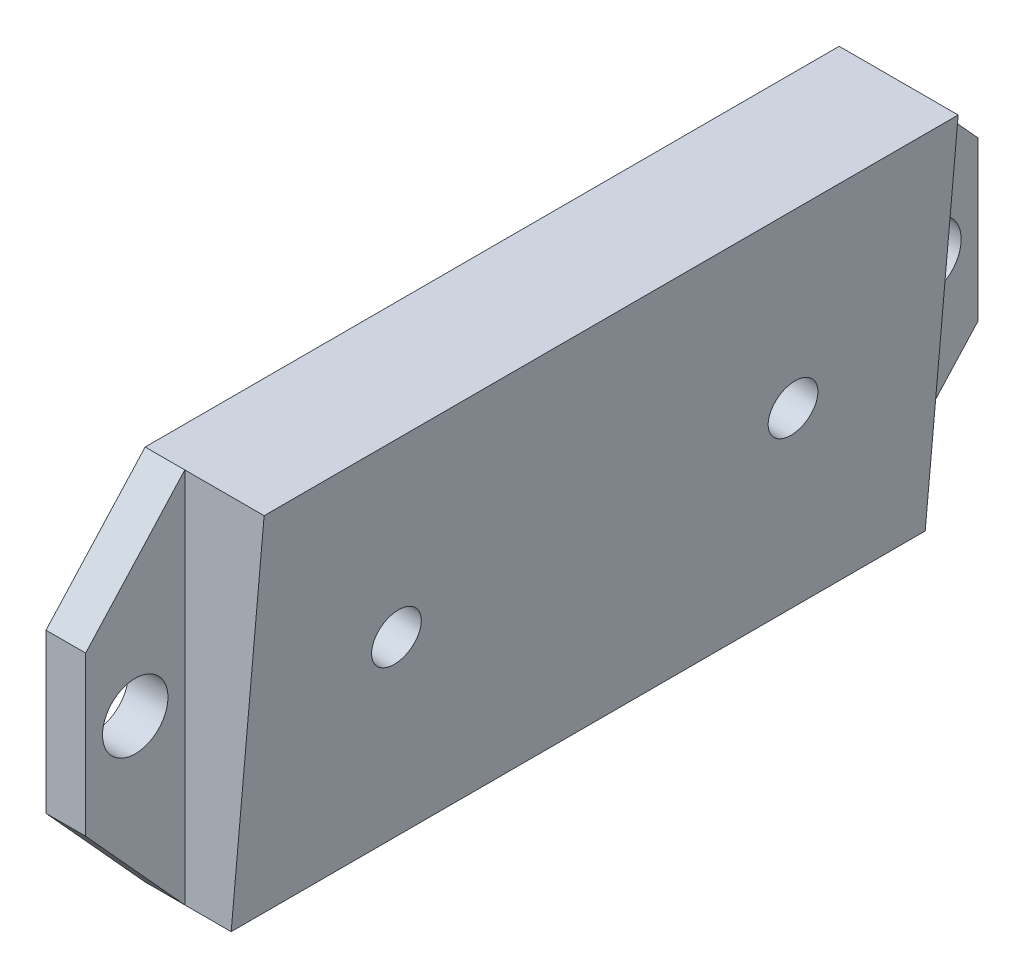
ISO-10303-21;
HEADER;
FILE_DESCRIPTION(('STEP AP214'),'2;1');
FILE_NAME('part.step','',(''),(''),'','','');
FILE_SCHEMA(('AUTOMOTIVE_DESIGN { 1 0 10303 214 1 1 1 1 }'));
ENDSEC;
DATA;
#1=APPLICATION_CONTEXT('core data for automotive mechanical design processes');
#2=APPLICATION_PROTOCOL_DEFINITION('international standard','automotive_design',2000,#1);
#3=PRODUCT_CONTEXT('',#1,'mechanical');
#4=PRODUCT('Part','Part','',(#3));
#5=PRODUCT_RELATED_PRODUCT_CATEGORY('part','',(#4));
#6=PRODUCT_DEFINITION_FORMATION('','',#4);
#7=PRODUCT_DEFINITION_CONTEXT('part definition',#1,'design');
#8=PRODUCT_DEFINITION('design','',#6,#7);
#9=PRODUCT_DEFINITION_SHAPE('','',#8);
#10=(LENGTH_UNIT() NAMED_UNIT(*) SI_UNIT(.MILLI.,.METRE.));
#11=(NAMED_UNIT(*) PLANE_ANGLE_UNIT() SI_UNIT($,.RADIAN.));
#12=(NAMED_UNIT(*) SI_UNIT($,.STERADIAN.) SOLID_ANGLE_UNIT());
#13=UNCERTAINTY_MEASURE_WITH_UNIT(LENGTH_MEASURE(1.E-05),#10,'distance_accuracy_value','');
#14=(GEOMETRIC_REPRESENTATION_CONTEXT(3) GLOBAL_UNCERTAINTY_ASSIGNED_CONTEXT((#13)) GLOBAL_UNIT_ASSIGNED_CONTEXT((#10,
#11,#12)) REPRESENTATION_CONTEXT('',''));
#15=CARTESIAN_POINT('',(0.,0.,0.));
#16=DIRECTION('',(0.,0.,1.));
#17=DIRECTION('',(1.,0.,0.));
#18=AXIS2_PLACEMENT_3D('',#15,#16,#17);
#19=CARTESIAN_POINT('',(8.67543078601516,-4.,80.));
#20=DIRECTION('',(-0.996194698091746,0.0871557427476512,0.));
#21=DIRECTION('',(-0.0871557427476512,-0.996194698091746,0.));
#22=AXIS2_PLACEMENT_3D('',#19,#20,#21);
#23=PLANE('',#22);
#24=CARTESIAN_POINT('',(10.3440408877946,15.0723007362568,15.));
#25=DIRECTION('',(-0.996194698091746,0.0871557427476512,0.));
#26=DIRECTION('',(0.0871557427476512,0.996194698091746,0.));
#27=AXIS2_PLACEMENT_3D('',#24,#25,#26);
#28=CIRCLE('',#27,2.49999999999999);
#29=CARTESIAN_POINT('',(10.5619302446638,17.5627874814862,15.));
#30=VERTEX_POINT('',#29);
#31=EDGE_CURVE('E155',#30,#30,#28,.T.);
#32=ORIENTED_EDGE('',*,*,#31,.T.);
#33=EDGE_LOOP('',(#32));
#34=FACE_BOUND('',#33,.T.);
#35=DIRECTION('',(0.,0.,-1.));
#36=VECTOR('',#35,1.);
#37=CARTESIAN_POINT('',(12.,34.,0.));
#38=LINE('',#37,#36);
#39=CARTESIAN_POINT('',(12.,34.,70.));
#40=VERTEX_POINT('',#39);
#41=CARTESIAN_POINT('',(12.,34.,0.));
#42=VERTEX_POINT('',#41);
#43=EDGE_CURVE('E225',#40,#42,#38,.T.);
#44=ORIENTED_EDGE('',*,*,#43,.F.);
#45=DIRECTION('',(-0.0871557427476512,-0.996194698091746,0.));
#46=VECTOR('',#45,1.);
#47=CARTESIAN_POINT('',(11.9392310120488,33.3054072893323,70.));
#48=LINE('',#47,#46);
#49=CARTESIAN_POINT('',(8.67543078601516,-4.,70.));
#50=VERTEX_POINT('',#49);
#51=EDGE_CURVE('E173',#40,#50,#48,.T.);
#52=ORIENTED_EDGE('',*,*,#51,.T.);
#53=DIRECTION('',(0.,0.,-1.));
#54=VECTOR('',#53,1.);
#55=CARTESIAN_POINT('',(8.67543078601516,-4.,80.));
#56=LINE('',#55,#54);
#57=CARTESIAN_POINT('',(8.67543078601516,-4.,0.));
#58=VERTEX_POINT('',#57);
#59=EDGE_CURVE('E170',#50,#58,#56,.T.);
#60=ORIENTED_EDGE('',*,*,#59,.T.);
#61=DIRECTION('',(-0.0871557427476512,-0.996194698091746,0.));
#62=VECTOR('',#61,1.);
#63=CARTESIAN_POINT('',(8.67543078601516,-4.,0.));
#64=LINE('',#63,#62);
#65=EDGE_CURVE('E167',#42,#58,#64,.T.);
#66=ORIENTED_EDGE('',*,*,#65,.F.);
#67=EDGE_LOOP('',(#44,#52,#60,#66));
#68=FACE_BOUND('',#67,.T.);
#69=CARTESIAN_POINT('',(10.3440408877946,15.0723007362568,55.));
#70=DIRECTION('',(-0.996194698091746,0.0871557427476512,0.));
#71=DIRECTION('',(0.0871557427476512,0.996194698091746,0.));
#72=AXIS2_PLACEMENT_3D('',#69,#70,#71);
#73=CIRCLE('',#72,2.49999999999999);
#74=CARTESIAN_POINT('',(10.5619302446638,17.5627874814862,55.));
#75=VERTEX_POINT('',#74);
#76=EDGE_CURVE('E154',#75,#75,#73,.T.);
#77=ORIENTED_EDGE('',*,*,#76,.T.);
#78=EDGE_LOOP('',(#77));
#79=FACE_BOUND('',#78,.T.);
#80=ADVANCED_FACE('F37',(#34,#68,#79),#23,.F.);
#81=CARTESIAN_POINT('',(12.,7.,-10.));
#82=DIRECTION('',(0.,0.672672793996312,0.739940073395944));
#83=DIRECTION('',(0.,0.739940073395944,-0.672672793996312));
#84=AXIS2_PLACEMENT_3D('',#81,#82,#83);
#85=PLANE('',#84);
#86=DIRECTION('',(0.,-0.739940073395944,0.672672793996312));
#87=VECTOR('',#86,1.);
#88=CARTESIAN_POINT('',(4.,7.,-10.));
#89=LINE('',#88,#87);
#90=CARTESIAN_POINT('',(4.,7.,-10.));
#91=VERTEX_POINT('',#90);
#92=CARTESIAN_POINT('',(4.,-4.,0.));
#93=VERTEX_POINT('',#92);
#94=EDGE_CURVE('E183',#91,#93,#89,.T.);
#95=ORIENTED_EDGE('',*,*,#94,.T.);
#96=DIRECTION('',(-1.,0.,0.));
#97=VECTOR('',#96,1.);
#98=CARTESIAN_POINT('',(12.,-4.,0.));
#99=LINE('',#98,#97);
#100=CARTESIAN_POINT('',(0.,-4.,0.));
#101=VERTEX_POINT('',#100);
#102=EDGE_CURVE('E45',#93,#101,#99,.T.);
#103=ORIENTED_EDGE('',*,*,#102,.T.);
#104=DIRECTION('',(0.,-0.739940073395944,0.672672793996312));
#105=VECTOR('',#104,1.);
#106=CARTESIAN_POINT('',(0.,7.,-10.));
#107=LINE('',#106,#105);
#108=CARTESIAN_POINT('',(0.,7.,-10.));
#109=VERTEX_POINT('',#108);
#110=EDGE_CURVE('E224',#109,#101,#107,.T.);
#111=ORIENTED_EDGE('',*,*,#110,.F.);
#112=DIRECTION('',(-1.,0.,0.));
#113=VECTOR('',#112,1.);
#114=CARTESIAN_POINT('',(12.,7.,-10.));
#115=LINE('',#114,#113);
#116=EDGE_CURVE('E228',#91,#109,#115,.T.);
#117=ORIENTED_EDGE('',*,*,#116,.F.);
#118=EDGE_LOOP('',(#95,#103,#111,#117));
#119=FACE_BOUND('',#118,.T.);
#120=ADVANCED_FACE('F39',(#119),#85,.F.);
#121=CARTESIAN_POINT('',(12.,7.,80.));
#122=DIRECTION('',(0.,0.672672793996311,-0.739940073395945));
#123=DIRECTION('',(0.,-0.739940073395945,-0.672672793996311));
#124=AXIS2_PLACEMENT_3D('',#121,#122,#123);
#125=PLANE('',#124);
#126=DIRECTION('',(0.,0.739940073395945,0.672672793996311));
#127=VECTOR('',#126,1.);
#128=CARTESIAN_POINT('',(4.,7.,80.));
#129=LINE('',#128,#127);
#130=CARTESIAN_POINT('',(4.,-4.,70.));
#131=VERTEX_POINT('',#130);
#132=CARTESIAN_POINT('',(4.,7.,80.));
#133=VERTEX_POINT('',#132);
#134=EDGE_CURVE('E176',#131,#133,#129,.T.);
#135=ORIENTED_EDGE('',*,*,#134,.T.);
#136=DIRECTION('',(-1.,0.,0.));
#137=VECTOR('',#136,1.);
#138=CARTESIAN_POINT('',(12.,7.,80.));
#139=LINE('',#138,#137);
#140=CARTESIAN_POINT('',(0.,7.,80.));
#141=VERTEX_POINT('',#140);
#142=EDGE_CURVE('E265',#133,#141,#139,.T.);
#143=ORIENTED_EDGE('',*,*,#142,.T.);
#144=DIRECTION('',(0.,0.739940073395945,0.672672793996311));
#145=VECTOR('',#144,1.);
#146=CARTESIAN_POINT('',(0.,7.,80.));
#147=LINE('',#146,#145);
#148=CARTESIAN_POINT('',(0.,-4.00000000000002,70.));
#149=VERTEX_POINT('',#148);
#150=EDGE_CURVE('E234',#149,#141,#147,.T.);
#151=ORIENTED_EDGE('',*,*,#150,.F.);
#152=DIRECTION('',(-1.,0.,0.));
#153=VECTOR('',#152,1.);
#154=CARTESIAN_POINT('',(12.,-4.00000000000002,70.));
#155=LINE('',#154,#153);
#156=EDGE_CURVE('E267',#131,#149,#155,.T.);
#157=ORIENTED_EDGE('',*,*,#156,.F.);
#158=EDGE_LOOP('',(#135,#143,#151,#157));
#159=FACE_BOUND('',#158,.T.);
#160=ADVANCED_FACE('F280',(#159),#125,.F.);
#161=CARTESIAN_POINT('',(12.,7.,80.));
#162=DIRECTION('',(0.,0.,-1.));
#163=DIRECTION('',(1.,0.,0.));
#164=AXIS2_PLACEMENT_3D('',#161,#162,#163);
#165=PLANE('',#164);
#166=DIRECTION('',(0.,1.,0.));
#167=VECTOR('',#166,1.);
#168=CARTESIAN_POINT('',(4.,23.,80.));
#169=LINE('',#168,#167);
#170=CARTESIAN_POINT('',(4.,23.,80.));
#171=VERTEX_POINT('',#170);
#172=EDGE_CURVE('E191',#133,#171,#169,.T.);
#173=ORIENTED_EDGE('',*,*,#172,.T.);
#174=DIRECTION('',(-1.,0.,0.));
#175=VECTOR('',#174,1.);
#176=CARTESIAN_POINT('',(12.,23.,80.));
#177=LINE('',#176,#175);
#178=CARTESIAN_POINT('',(0.,23.,80.));
#179=VERTEX_POINT('',#178);
#180=EDGE_CURVE('E262',#171,#179,#177,.T.);
#181=ORIENTED_EDGE('',*,*,#180,.T.);
#182=DIRECTION('',(0.,1.,0.));
#183=VECTOR('',#182,1.);
#184=CARTESIAN_POINT('',(0.,7.,80.));
#185=LINE('',#184,#183);
#186=EDGE_CURVE('E237',#141,#179,#185,.T.);
#187=ORIENTED_EDGE('',*,*,#186,.F.);
#188=ORIENTED_EDGE('',*,*,#142,.F.);
#189=EDGE_LOOP('',(#173,#181,#187,#188));
#190=FACE_BOUND('',#189,.T.);
#191=ADVANCED_FACE('F302',(#190),#165,.F.);
#192=CARTESIAN_POINT('',(12.,23.,80.));
#193=DIRECTION('',(0.,-0.672672793996311,-0.739940073395945));
#194=DIRECTION('',(0.,-0.739940073395945,0.672672793996311));
#195=AXIS2_PLACEMENT_3D('',#192,#193,#194);
#196=PLANE('',#195);
#197=DIRECTION('',(0.,0.739940073395945,-0.672672793996311));
#198=VECTOR('',#197,1.);
#199=CARTESIAN_POINT('',(4.,34.,70.));
#200=LINE('',#199,#198);
#201=CARTESIAN_POINT('',(4.,34.,70.));
#202=VERTEX_POINT('',#201);
#203=EDGE_CURVE('E194',#171,#202,#200,.T.);
#204=ORIENTED_EDGE('',*,*,#203,.T.);
#205=DIRECTION('',(-1.,0.,0.));
#206=VECTOR('',#205,1.);
#207=CARTESIAN_POINT('',(12.,34.,70.));
#208=LINE('',#207,#206);
#209=CARTESIAN_POINT('',(0.,34.,70.));
#210=VERTEX_POINT('',#209);
#211=EDGE_CURVE('E258',#202,#210,#208,.T.);
#212=ORIENTED_EDGE('',*,*,#211,.T.);
#213=DIRECTION('',(0.,0.739940073395945,-0.672672793996311));
#214=VECTOR('',#213,1.);
#215=CARTESIAN_POINT('',(0.,23.,80.));
#216=LINE('',#215,#214);
#217=EDGE_CURVE('E240',#179,#210,#216,.T.);
#218=ORIENTED_EDGE('',*,*,#217,.F.);
#219=ORIENTED_EDGE('',*,*,#180,.F.);
#220=EDGE_LOOP('',(#204,#212,#218,#219));
#221=FACE_BOUND('',#220,.T.);
#222=ADVANCED_FACE('F304',(#221),#196,.F.);
#223=CARTESIAN_POINT('',(12.,23.,-10.));
#224=DIRECTION('',(0.,-0.672672793996312,0.739940073395944));
#225=DIRECTION('',(0.,0.739940073395944,0.672672793996312));
#226=AXIS2_PLACEMENT_3D('',#223,#224,#225);
#227=PLANE('',#226);
#228=DIRECTION('',(0.,-0.739940073395944,-0.672672793996312));
#229=VECTOR('',#228,1.);
#230=CARTESIAN_POINT('',(4.,34.,0.));
#231=LINE('',#230,#229);
#232=CARTESIAN_POINT('',(4.,34.,0.));
#233=VERTEX_POINT('',#232);
#234=CARTESIAN_POINT('',(4.,23.,-10.));
#235=VERTEX_POINT('',#234);
#236=EDGE_CURVE('E177',#233,#235,#231,.T.);
#237=ORIENTED_EDGE('',*,*,#236,.T.);
#238=DIRECTION('',(-1.,0.,0.));
#239=VECTOR('',#238,1.);
#240=CARTESIAN_POINT('',(12.,23.,-10.));
#241=LINE('',#240,#239);
#242=CARTESIAN_POINT('',(0.,23.,-10.));
#243=VERTEX_POINT('',#242);
#244=EDGE_CURVE('E251',#235,#243,#241,.T.);
#245=ORIENTED_EDGE('',*,*,#244,.T.);
#246=DIRECTION('',(0.,-0.739940073395944,-0.672672793996312));
#247=VECTOR('',#246,1.);
#248=CARTESIAN_POINT('',(0.,23.,-10.));
#249=LINE('',#248,#247);
#250=CARTESIAN_POINT('',(0.,34.,0.));
#251=VERTEX_POINT('',#250);
#252=EDGE_CURVE('E245',#251,#243,#249,.T.);
#253=ORIENTED_EDGE('',*,*,#252,.F.);
#254=DIRECTION('',(-1.,0.,0.));
#255=VECTOR('',#254,1.);
#256=CARTESIAN_POINT('',(12.,34.,0.));
#257=LINE('',#256,#255);
#258=EDGE_CURVE('E254',#233,#251,#257,.T.);
#259=ORIENTED_EDGE('',*,*,#258,.F.);
#260=EDGE_LOOP('',(#237,#245,#253,#259));
#261=FACE_BOUND('',#260,.T.);
#262=ADVANCED_FACE('F313',(#261),#227,.F.);
#263=CARTESIAN_POINT('',(12.,7.,-10.));
#264=DIRECTION('',(0.,0.,1.));
#265=DIRECTION('',(-1.,0.,0.));
#266=AXIS2_PLACEMENT_3D('',#263,#264,#265);
#267=PLANE('',#266);
#268=DIRECTION('',(0.,-1.,0.));
#269=VECTOR('',#268,1.);
#270=CARTESIAN_POINT('',(4.,23.,-10.));
#271=LINE('',#270,#269);
#272=EDGE_CURVE('E180',#235,#91,#271,.T.);
#273=ORIENTED_EDGE('',*,*,#272,.T.);
#274=ORIENTED_EDGE('',*,*,#116,.T.);
#275=DIRECTION('',(0.,-1.,0.));
#276=VECTOR('',#275,1.);
#277=CARTESIAN_POINT('',(0.,7.,-10.));
#278=LINE('',#277,#276);
#279=EDGE_CURVE('E229',#243,#109,#278,.T.);
#280=ORIENTED_EDGE('',*,*,#279,.F.);
#281=ORIENTED_EDGE('',*,*,#244,.F.);
#282=EDGE_LOOP('',(#273,#274,#280,#281));
#283=FACE_BOUND('',#282,.T.);
#284=ADVANCED_FACE('F316',(#283),#267,.F.);
#285=CARTESIAN_POINT('',(12.,-4.,0.));
#286=DIRECTION('',(0.,1.,0.));
#287=DIRECTION('',(0.,0.,-1.));
#288=AXIS2_PLACEMENT_3D('',#285,#286,#287);
#289=PLANE('',#288);
#290=EDGE_CURVE('E268',#50,#131,#155,.T.);
#291=ORIENTED_EDGE('',*,*,#290,.T.);
#292=ORIENTED_EDGE('',*,*,#156,.T.);
#293=DIRECTION('',(0.,0.,1.));
#294=VECTOR('',#293,1.);
#295=CARTESIAN_POINT('',(0.,-4.,0.));
#296=LINE('',#295,#294);
#297=EDGE_CURVE('E232',#101,#149,#296,.T.);
#298=ORIENTED_EDGE('',*,*,#297,.F.);
#299=ORIENTED_EDGE('',*,*,#102,.F.);
#300=EDGE_CURVE('E11',#58,#93,#99,.T.);
#301=ORIENTED_EDGE('',*,*,#300,.F.);
#302=ORIENTED_EDGE('',*,*,#59,.F.);
#303=EDGE_LOOP('',(#291,#292,#298,#299,#301,#302));
#304=FACE_BOUND('',#303,.T.);
#305=ADVANCED_FACE('F276',(#304),#289,.F.);
#306=CARTESIAN_POINT('',(12.,34.,0.));
#307=DIRECTION('',(0.,-1.,0.));
#308=DIRECTION('',(0.,0.,1.));
#309=AXIS2_PLACEMENT_3D('',#306,#307,#308);
#310=PLANE('',#309);
#311=DIRECTION('',(0.,0.,-1.));
#312=VECTOR('',#311,1.);
#313=CARTESIAN_POINT('',(0.,34.,0.));
#314=LINE('',#313,#312);
#315=EDGE_CURVE('E243',#210,#251,#314,.T.);
#316=ORIENTED_EDGE('',*,*,#315,.F.);
#317=ORIENTED_EDGE('',*,*,#211,.F.);
#318=EDGE_CURVE('E259',#40,#202,#208,.T.);
#319=ORIENTED_EDGE('',*,*,#318,.F.);
#320=ORIENTED_EDGE('',*,*,#43,.T.);
#321=EDGE_CURVE('E255',#42,#233,#257,.T.);
#322=ORIENTED_EDGE('',*,*,#321,.T.);
#323=ORIENTED_EDGE('',*,*,#258,.T.);
#324=EDGE_LOOP('',(#316,#317,#319,#320,#322,#323));
#325=FACE_BOUND('',#324,.T.);
#326=ADVANCED_FACE('F310',(#325),#310,.F.);
#327=CARTESIAN_POINT('',(0.,0.,0.));
#328=DIRECTION('',(-1.,0.,0.));
#329=DIRECTION('',(0.,0.,-1.));
#330=AXIS2_PLACEMENT_3D('',#327,#328,#329);
#331=PLANE('',#330);
#332=CARTESIAN_POINT('',(0.,15.,-5.));
#333=DIRECTION('',(1.,0.,0.));
#334=DIRECTION('',(0.,0.,-1.));
#335=AXIS2_PLACEMENT_3D('',#332,#333,#334);
#336=CIRCLE('',#335,3.29999999999999);
#337=CARTESIAN_POINT('',(0.,15.,-8.29999999999999));
#338=VERTEX_POINT('',#337);
#339=EDGE_CURVE('E355',#338,#338,#336,.T.);
#340=ORIENTED_EDGE('',*,*,#339,.T.);
#341=EDGE_LOOP('',(#340));
#342=FACE_BOUND('',#341,.T.);
#343=CARTESIAN_POINT('',(0.,15.,75.));
#344=DIRECTION('',(1.,0.,0.));
#345=DIRECTION('',(0.,0.,-1.));
#346=AXIS2_PLACEMENT_3D('',#343,#344,#345);
#347=CIRCLE('',#346,3.29999999999999);
#348=CARTESIAN_POINT('',(0.,15.,71.7));
#349=VERTEX_POINT('',#348);
#350=EDGE_CURVE('E161',#349,#349,#347,.T.);
#351=ORIENTED_EDGE('',*,*,#350,.T.);
#352=EDGE_LOOP('',(#351));
#353=FACE_BOUND('',#352,.T.);
#354=CARTESIAN_POINT('',(0.,15.,55.));
#355=DIRECTION('',(1.,0.,0.));
#356=DIRECTION('',(0.,0.,-1.));
#357=AXIS2_PLACEMENT_3D('',#354,#355,#356);
#358=CIRCLE('',#357,5.);
#359=CARTESIAN_POINT('',(0.,20.,55.));
#360=VERTEX_POINT('',#359);
#361=CARTESIAN_POINT('',(0.,10.,55.));
#362=VERTEX_POINT('',#361);
#363=EDGE_CURVE('E188',#360,#362,#358,.T.);
#364=ORIENTED_EDGE('',*,*,#363,.T.);
#365=DIRECTION('',(0.,0.,-1.));
#366=VECTOR('',#365,1.);
#367=CARTESIAN_POINT('',(0.,10.,55.));
#368=LINE('',#367,#366);
#369=CARTESIAN_POINT('',(0.,10.,15.));
#370=VERTEX_POINT('',#369);
#371=EDGE_CURVE('E211',#362,#370,#368,.T.);
#372=ORIENTED_EDGE('',*,*,#371,.T.);
#373=CARTESIAN_POINT('',(0.,15.,15.));
#374=DIRECTION('',(1.,0.,0.));
#375=DIRECTION('',(0.,0.,-1.));
#376=AXIS2_PLACEMENT_3D('',#373,#374,#375);
#377=CIRCLE('',#376,5.);
#378=CARTESIAN_POINT('',(0.,20.,15.));
#379=VERTEX_POINT('',#378);
#380=EDGE_CURVE('E214',#370,#379,#377,.T.);
#381=ORIENTED_EDGE('',*,*,#380,.T.);
#382=DIRECTION('',(0.,0.,1.));
#383=VECTOR('',#382,1.);
#384=CARTESIAN_POINT('',(0.,20.,55.));
#385=LINE('',#384,#383);
#386=EDGE_CURVE('E202',#379,#360,#385,.T.);
#387=ORIENTED_EDGE('',*,*,#386,.T.);
#388=EDGE_LOOP('',(#364,#372,#381,#387));
#389=FACE_BOUND('',#388,.T.);
#390=ORIENTED_EDGE('',*,*,#110,.T.);
#391=ORIENTED_EDGE('',*,*,#297,.T.);
#392=ORIENTED_EDGE('',*,*,#150,.T.);
#393=ORIENTED_EDGE('',*,*,#186,.T.);
#394=ORIENTED_EDGE('',*,*,#217,.T.);
#395=ORIENTED_EDGE('',*,*,#315,.T.);
#396=ORIENTED_EDGE('',*,*,#252,.T.);
#397=ORIENTED_EDGE('',*,*,#279,.T.);
#398=EDGE_LOOP('',(#390,#391,#392,#393,#394,#395,#396,#397));
#399=FACE_BOUND('',#398,.T.);
#400=ADVANCED_FACE('F283',(#342,#353,#389,#399),#331,.T.);
#401=CARTESIAN_POINT('',(-10.,15.,55.));
#402=DIRECTION('',(1.,0.,0.));
#403=DIRECTION('',(0.,0.,1.));
#404=AXIS2_PLACEMENT_3D('',#401,#402,#403);
#405=CYLINDRICAL_SURFACE('',#404,5.);
#406=ORIENTED_EDGE('',*,*,#363,.F.);
#407=DIRECTION('',(1.,0.,0.));
#408=VECTOR('',#407,1.);
#409=CARTESIAN_POINT('',(-10.,20.,55.));
#410=LINE('',#409,#408);
#411=CARTESIAN_POINT('',(-10.,20.,55.));
#412=VERTEX_POINT('',#411);
#413=EDGE_CURVE('E52',#412,#360,#410,.T.);
#414=ORIENTED_EDGE('',*,*,#413,.F.);
#415=CARTESIAN_POINT('',(-10.,15.,55.));
#416=DIRECTION('',(1.,0.,0.));
#417=DIRECTION('',(0.,0.,-1.));
#418=AXIS2_PLACEMENT_3D('',#415,#416,#417);
#419=CIRCLE('',#418,5.);
#420=CARTESIAN_POINT('',(-10.,10.,55.));
#421=VERTEX_POINT('',#420);
#422=EDGE_CURVE('E198',#412,#421,#419,.T.);
#423=ORIENTED_EDGE('',*,*,#422,.T.);
#424=DIRECTION('',(1.,0.,0.));
#425=VECTOR('',#424,1.);
#426=CARTESIAN_POINT('',(-10.,10.,55.));
#427=LINE('',#426,#425);
#428=EDGE_CURVE('E222',#421,#362,#427,.T.);
#429=ORIENTED_EDGE('',*,*,#428,.T.);
#430=EDGE_LOOP('',(#406,#414,#423,#429));
#431=FACE_BOUND('',#430,.T.);
#432=ADVANCED_FACE('F390',(#431),#405,.T.);
#433=CARTESIAN_POINT('',(-10.,10.,55.));
#434=DIRECTION('',(0.,1.,0.));
#435=DIRECTION('',(0.,0.,-1.));
#436=AXIS2_PLACEMENT_3D('',#433,#434,#435);
#437=PLANE('',#436);
#438=ORIENTED_EDGE('',*,*,#371,.F.);
#439=ORIENTED_EDGE('',*,*,#428,.F.);
#440=DIRECTION('',(0.,0.,-1.));
#441=VECTOR('',#440,1.);
#442=CARTESIAN_POINT('',(-10.,10.,55.));
#443=LINE('',#442,#441);
#444=CARTESIAN_POINT('',(-10.,10.,15.));
#445=VERTEX_POINT('',#444);
#446=EDGE_CURVE('E201',#421,#445,#443,.T.);
#447=ORIENTED_EDGE('',*,*,#446,.T.);
#448=DIRECTION('',(1.,0.,0.));
#449=VECTOR('',#448,1.);
#450=CARTESIAN_POINT('',(-10.,10.,15.));
#451=LINE('',#450,#449);
#452=EDGE_CURVE('E220',#445,#370,#451,.T.);
#453=ORIENTED_EDGE('',*,*,#452,.T.);
#454=EDGE_LOOP('',(#438,#439,#447,#453));
#455=FACE_BOUND('',#454,.T.);
#456=ADVANCED_FACE('F387',(#455),#437,.F.);
#457=CARTESIAN_POINT('',(-10.,15.,15.));
#458=DIRECTION('',(1.,0.,0.));
#459=DIRECTION('',(0.,0.,1.));
#460=AXIS2_PLACEMENT_3D('',#457,#458,#459);
#461=CYLINDRICAL_SURFACE('',#460,5.);
#462=ORIENTED_EDGE('',*,*,#380,.F.);
#463=ORIENTED_EDGE('',*,*,#452,.F.);
#464=CARTESIAN_POINT('',(-10.,15.,15.));
#465=DIRECTION('',(1.,0.,0.));
#466=DIRECTION('',(0.,0.,-1.));
#467=AXIS2_PLACEMENT_3D('',#464,#465,#466);
#468=CIRCLE('',#467,5.);
#469=CARTESIAN_POINT('',(-10.,20.,15.));
#470=VERTEX_POINT('',#469);
#471=EDGE_CURVE('E205',#445,#470,#468,.T.);
#472=ORIENTED_EDGE('',*,*,#471,.T.);
#473=DIRECTION('',(1.,0.,0.));
#474=VECTOR('',#473,1.);
#475=CARTESIAN_POINT('',(-10.,20.,15.));
#476=LINE('',#475,#474);
#477=EDGE_CURVE('E60',#470,#379,#476,.T.);
#478=ORIENTED_EDGE('',*,*,#477,.T.);
#479=EDGE_LOOP('',(#462,#463,#472,#478));
#480=FACE_BOUND('',#479,.T.);
#481=ADVANCED_FACE('F384',(#480),#461,.T.);
#482=CARTESIAN_POINT('',(-10.,20.,55.));
#483=DIRECTION('',(0.,-1.,0.));
#484=DIRECTION('',(0.,0.,1.));
#485=AXIS2_PLACEMENT_3D('',#482,#483,#484);
#486=PLANE('',#485);
#487=ORIENTED_EDGE('',*,*,#386,.F.);
#488=ORIENTED_EDGE('',*,*,#477,.F.);
#489=DIRECTION('',(0.,0.,1.));
#490=VECTOR('',#489,1.);
#491=CARTESIAN_POINT('',(-10.,20.,55.));
#492=LINE('',#491,#490);
#493=EDGE_CURVE('E207',#470,#412,#492,.T.);
#494=ORIENTED_EDGE('',*,*,#493,.T.);
#495=ORIENTED_EDGE('',*,*,#413,.T.);
#496=EDGE_LOOP('',(#487,#488,#494,#495));
#497=FACE_BOUND('',#496,.T.);
#498=ADVANCED_FACE('F380',(#497),#486,.F.);
#499=CARTESIAN_POINT('',(-10.,15.,55.));
#500=DIRECTION('',(-1.,0.,0.));
#501=DIRECTION('',(0.,0.,-1.));
#502=AXIS2_PLACEMENT_3D('',#499,#500,#501);
#503=PLANE('',#502);
#504=ORIENTED_EDGE('',*,*,#422,.F.);
#505=ORIENTED_EDGE('',*,*,#493,.F.);
#506=ORIENTED_EDGE('',*,*,#471,.F.);
#507=ORIENTED_EDGE('',*,*,#446,.F.);
#508=EDGE_LOOP('',(#504,#505,#506,#507));
#509=FACE_BOUND('',#508,.T.);
#510=ADVANCED_FACE('F375',(#509),#503,.T.);
#511=CARTESIAN_POINT('',(4.,34.,70.));
#512=DIRECTION('',(0.,0.,-1.));
#513=DIRECTION('',(1.,0.,0.));
#514=AXIS2_PLACEMENT_3D('',#511,#512,#513);
#515=PLANE('',#514);
#516=ORIENTED_EDGE('',*,*,#318,.T.);
#517=DIRECTION('',(0.,-1.,0.));
#518=VECTOR('',#517,1.);
#519=CARTESIAN_POINT('',(4.,34.,70.));
#520=LINE('',#519,#518);
#521=EDGE_CURVE('E181',#202,#131,#520,.T.);
#522=ORIENTED_EDGE('',*,*,#521,.T.);
#523=ORIENTED_EDGE('',*,*,#290,.F.);
#524=ORIENTED_EDGE('',*,*,#51,.F.);
#525=EDGE_LOOP('',(#516,#522,#523,#524));
#526=FACE_BOUND('',#525,.T.);
#527=ADVANCED_FACE('F296',(#526),#515,.F.);
#528=CARTESIAN_POINT('',(4.,0.,0.));
#529=DIRECTION('',(1.,0.,0.));
#530=DIRECTION('',(0.,0.,1.));
#531=AXIS2_PLACEMENT_3D('',#528,#529,#530);
#532=PLANE('',#531);
#533=CARTESIAN_POINT('',(4.,15.,75.));
#534=DIRECTION('',(-1.,0.,0.));
#535=DIRECTION('',(0.,0.,1.));
#536=AXIS2_PLACEMENT_3D('',#533,#534,#535);
#537=CIRCLE('',#536,3.29999999999999);
#538=CARTESIAN_POINT('',(4.,15.,78.3));
#539=VERTEX_POINT('',#538);
#540=EDGE_CURVE('E359',#539,#539,#537,.T.);
#541=ORIENTED_EDGE('',*,*,#540,.T.);
#542=EDGE_LOOP('',(#541));
#543=FACE_BOUND('',#542,.T.);
#544=ORIENTED_EDGE('',*,*,#134,.F.);
#545=ORIENTED_EDGE('',*,*,#521,.F.);
#546=ORIENTED_EDGE('',*,*,#203,.F.);
#547=ORIENTED_EDGE('',*,*,#172,.F.);
#548=EDGE_LOOP('',(#544,#545,#546,#547));
#549=FACE_BOUND('',#548,.T.);
#550=ADVANCED_FACE('F299',(#543,#549),#532,.T.);
#551=CARTESIAN_POINT('',(4.,34.,0.));
#552=DIRECTION('',(0.,0.,1.));
#553=DIRECTION('',(-1.,0.,0.));
#554=AXIS2_PLACEMENT_3D('',#551,#552,#553);
#555=PLANE('',#554);
#556=ORIENTED_EDGE('',*,*,#300,.T.);
#557=DIRECTION('',(0.,1.,0.));
#558=VECTOR('',#557,1.);
#559=CARTESIAN_POINT('',(4.,34.,0.));
#560=LINE('',#559,#558);
#561=EDGE_CURVE('E186',#93,#233,#560,.T.);
#562=ORIENTED_EDGE('',*,*,#561,.T.);
#563=ORIENTED_EDGE('',*,*,#321,.F.);
#564=ORIENTED_EDGE('',*,*,#65,.T.);
#565=EDGE_LOOP('',(#556,#562,#563,#564));
#566=FACE_BOUND('',#565,.T.);
#567=ADVANCED_FACE('F290',(#566),#555,.F.);
#568=CARTESIAN_POINT('',(4.,0.,0.));
#569=DIRECTION('',(1.,0.,0.));
#570=DIRECTION('',(0.,0.,1.));
#571=AXIS2_PLACEMENT_3D('',#568,#569,#570);
#572=PLANE('',#571);
#573=CARTESIAN_POINT('',(4.,15.,-5.));
#574=DIRECTION('',(-1.,0.,0.));
#575=DIRECTION('',(0.,0.,1.));
#576=AXIS2_PLACEMENT_3D('',#573,#574,#575);
#577=CIRCLE('',#576,3.29999999999999);
#578=CARTESIAN_POINT('',(4.,15.,-1.70000000000001));
#579=VERTEX_POINT('',#578);
#580=EDGE_CURVE('E357',#579,#579,#577,.T.);
#581=ORIENTED_EDGE('',*,*,#580,.T.);
#582=EDGE_LOOP('',(#581));
#583=FACE_BOUND('',#582,.T.);
#584=ORIENTED_EDGE('',*,*,#236,.F.);
#585=ORIENTED_EDGE('',*,*,#561,.F.);
#586=ORIENTED_EDGE('',*,*,#94,.F.);
#587=ORIENTED_EDGE('',*,*,#272,.F.);
#588=EDGE_LOOP('',(#584,#585,#586,#587));
#589=FACE_BOUND('',#588,.T.);
#590=ADVANCED_FACE('F318',(#583,#589),#572,.T.);
#591=CARTESIAN_POINT('',(-3.60268488548982,16.2924811347239,55.));
#592=DIRECTION('',(0.996194698091746,-0.0871557427476512,0.));
#593=DIRECTION('',(0.0871557427476512,0.996194698091746,0.));
#594=AXIS2_PLACEMENT_3D('',#591,#592,#593);
#595=CONICAL_SURFACE('',#594,2.5,1.02974425867665);
#596=CARTESIAN_POINT('',(-5.09912029290827,16.4234022685718,55.));
#597=VERTEX_POINT('',#596);
#598=VERTEX_LOOP('',#597);
#599=FACE_BOUND('',#598,.T.);
#600=CARTESIAN_POINT('',(-3.60268488548982,16.2924811347239,55.));
#601=DIRECTION('',(-0.996194698091746,0.0871557427476512,0.));
#602=DIRECTION('',(0.0871557427476512,0.996194698091746,0.));
#603=AXIS2_PLACEMENT_3D('',#600,#601,#602);
#604=CIRCLE('',#603,2.5);
#605=CARTESIAN_POINT('',(-3.3847955286207,18.7829678799533,55.));
#606=VERTEX_POINT('',#605);
#607=EDGE_CURVE('E158',#606,#606,#604,.T.);
#608=ORIENTED_EDGE('',*,*,#607,.F.);
#609=EDGE_LOOP('',(#608));
#610=FACE_BOUND('',#609,.T.);
#611=ADVANCED_FACE('F320',(#599,#610),#595,.F.);
#612=CARTESIAN_POINT('',(10.3440408877946,15.0723007362568,55.));
#613=DIRECTION('',(0.996194698091746,-0.0871557427476512,0.));
#614=DIRECTION('',(0.0871557427476512,0.996194698091746,0.));
#615=AXIS2_PLACEMENT_3D('',#612,#613,#614);
#616=CYLINDRICAL_SURFACE('',#615,2.49999999999999);
#617=ORIENTED_EDGE('',*,*,#607,.T.);
#618=EDGE_LOOP('',(#617));
#619=FACE_BOUND('',#618,.T.);
#620=ORIENTED_EDGE('',*,*,#76,.F.);
#621=EDGE_LOOP('',(#620));
#622=FACE_BOUND('',#621,.T.);
#623=ADVANCED_FACE('F148',(#619,#622),#616,.F.);
#624=CARTESIAN_POINT('',(-3.60268488548982,16.2924811347239,15.));
#625=DIRECTION('',(0.996194698091746,-0.0871557427476512,0.));
#626=DIRECTION('',(0.0871557427476512,0.996194698091746,0.));
#627=AXIS2_PLACEMENT_3D('',#624,#625,#626);
#628=CONICAL_SURFACE('',#627,2.5,1.02974425867665);
#629=CARTESIAN_POINT('',(-5.09912029290827,16.4234022685718,15.));
#630=VERTEX_POINT('',#629);
#631=VERTEX_LOOP('',#630);
#632=FACE_BOUND('',#631,.T.);
#633=CARTESIAN_POINT('',(-3.60268488548982,16.2924811347239,15.));
#634=DIRECTION('',(-0.996194698091746,0.0871557427476512,0.));
#635=DIRECTION('',(0.0871557427476512,0.996194698091746,0.));
#636=AXIS2_PLACEMENT_3D('',#633,#634,#635);
#637=CIRCLE('',#636,2.5);
#638=CARTESIAN_POINT('',(-3.3847955286207,18.7829678799533,15.));
#639=VERTEX_POINT('',#638);
#640=EDGE_CURVE('E152',#639,#639,#637,.T.);
#641=ORIENTED_EDGE('',*,*,#640,.F.);
#642=EDGE_LOOP('',(#641));
#643=FACE_BOUND('',#642,.T.);
#644=ADVANCED_FACE('F144',(#632,#643),#628,.F.);
#645=CARTESIAN_POINT('',(10.3440408877946,15.0723007362568,15.));
#646=DIRECTION('',(0.996194698091746,-0.0871557427476512,0.));
#647=DIRECTION('',(0.0871557427476512,0.996194698091746,0.));
#648=AXIS2_PLACEMENT_3D('',#645,#646,#647);
#649=CYLINDRICAL_SURFACE('',#648,2.49999999999999);
#650=ORIENTED_EDGE('',*,*,#640,.T.);
#651=EDGE_LOOP('',(#650));
#652=FACE_BOUND('',#651,.T.);
#653=ORIENTED_EDGE('',*,*,#31,.F.);
#654=EDGE_LOOP('',(#653));
#655=FACE_BOUND('',#654,.T.);
#656=ADVANCED_FACE('F147',(#652,#655),#649,.F.);
#657=CARTESIAN_POINT('',(4.,15.,75.));
#658=DIRECTION('',(1.,0.,0.));
#659=DIRECTION('',(0.,0.,1.));
#660=AXIS2_PLACEMENT_3D('',#657,#658,#659);
#661=CYLINDRICAL_SURFACE('',#660,3.29999999999999);
#662=ORIENTED_EDGE('',*,*,#350,.F.);
#663=EDGE_LOOP('',(#662));
#664=FACE_BOUND('',#663,.T.);
#665=ORIENTED_EDGE('',*,*,#540,.F.);
#666=EDGE_LOOP('',(#665));
#667=FACE_BOUND('',#666,.T.);
#668=ADVANCED_FACE('F343',(#664,#667),#661,.F.);
#669=CARTESIAN_POINT('',(4.,15.,-5.));
#670=DIRECTION('',(1.,0.,0.));
#671=DIRECTION('',(0.,0.,1.));
#672=AXIS2_PLACEMENT_3D('',#669,#670,#671);
#673=CYLINDRICAL_SURFACE('',#672,3.29999999999999);
#674=ORIENTED_EDGE('',*,*,#339,.F.);
#675=EDGE_LOOP('',(#674));
#676=FACE_BOUND('',#675,.T.);
#677=ORIENTED_EDGE('',*,*,#580,.F.);
#678=EDGE_LOOP('',(#677));
#679=FACE_BOUND('',#678,.T.);
#680=ADVANCED_FACE('F346',(#676,#679),#673,.F.);
#681=CLOSED_SHELL('',(#80,#120,#160,#191,#222,#262,#284,#305,#326,#400,#432,#456,#481,#498,#510,
#527,#550,#567,#590,#611,#623,#644,#656,#668,#680));
#682=MANIFOLD_SOLID_BREP('B2',#681);
#683=ADVANCED_BREP_SHAPE_REPRESENTATION('',(#18,#682),#14);
#684=SHAPE_DEFINITION_REPRESENTATION(#9,#683);
ENDSEC;
END-ISO-10303-21;
